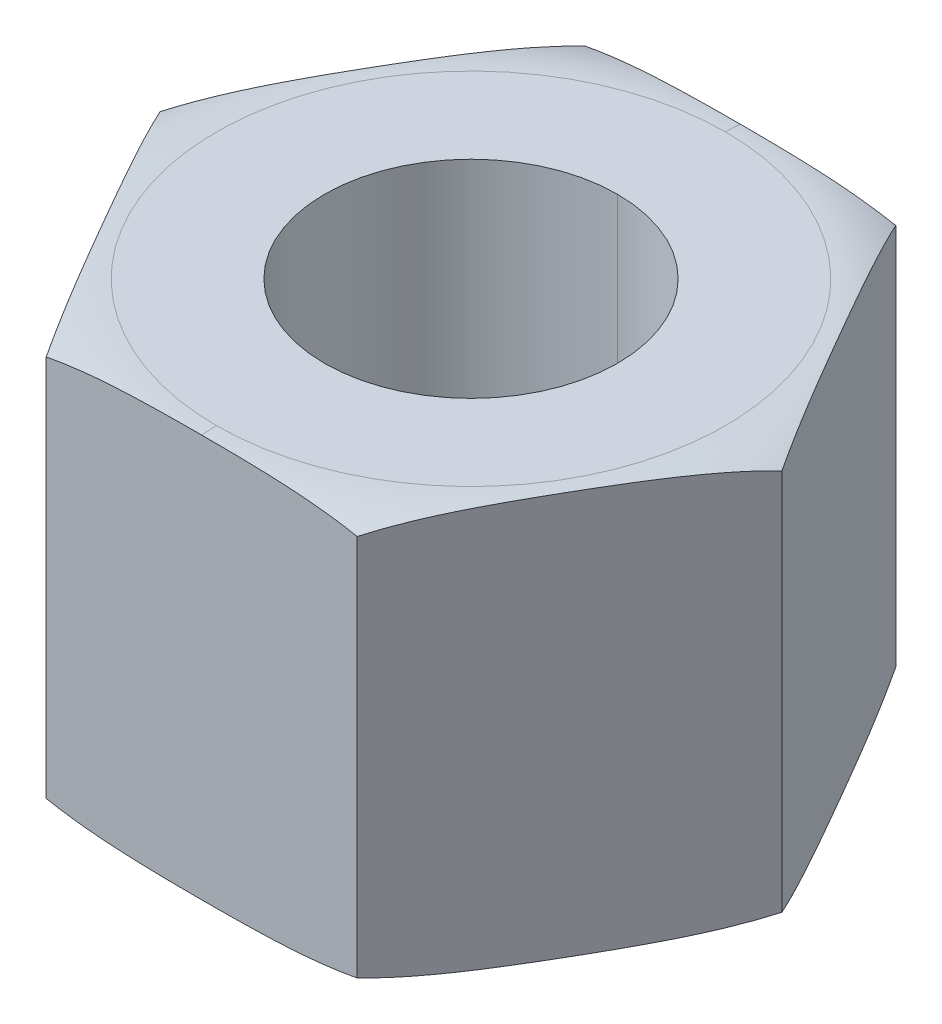
ISO-10303-21;
HEADER;
FILE_DESCRIPTION(('STEP AP214'),'2;1');
FILE_NAME('part.step','',(''),(''),'','','');
FILE_SCHEMA(('AUTOMOTIVE_DESIGN { 1 0 10303 214 1 1 1 1 }'));
ENDSEC;
DATA;
#1=APPLICATION_CONTEXT('core data for automotive mechanical design processes');
#2=APPLICATION_PROTOCOL_DEFINITION('international standard','automotive_design',2000,#1);
#3=PRODUCT_CONTEXT('',#1,'mechanical');
#4=PRODUCT('Part','Part','',(#3));
#5=PRODUCT_RELATED_PRODUCT_CATEGORY('part','',(#4));
#6=PRODUCT_DEFINITION_FORMATION('','',#4);
#7=PRODUCT_DEFINITION_CONTEXT('part definition',#1,'design');
#8=PRODUCT_DEFINITION('design','',#6,#7);
#9=PRODUCT_DEFINITION_SHAPE('','',#8);
#10=(LENGTH_UNIT() NAMED_UNIT(*) SI_UNIT(.MILLI.,.METRE.));
#11=(NAMED_UNIT(*) PLANE_ANGLE_UNIT() SI_UNIT($,.RADIAN.));
#12=(NAMED_UNIT(*) SI_UNIT($,.STERADIAN.) SOLID_ANGLE_UNIT());
#13=UNCERTAINTY_MEASURE_WITH_UNIT(LENGTH_MEASURE(1.E-05),#10,'distance_accuracy_value','');
#14=(GEOMETRIC_REPRESENTATION_CONTEXT(3) GLOBAL_UNCERTAINTY_ASSIGNED_CONTEXT((#13)) GLOBAL_UNIT_ASSIGNED_CONTEXT((#10,
#11,#12)) REPRESENTATION_CONTEXT('',''));
#15=CARTESIAN_POINT('',(0.,0.,0.));
#16=DIRECTION('',(0.,0.,1.));
#17=DIRECTION('',(1.,0.,0.));
#18=AXIS2_PLACEMENT_3D('',#15,#16,#17);
#19=CARTESIAN_POINT('',(0.,2.38125,0.));
#20=DIRECTION('',(0.,1.,0.));
#21=DIRECTION('',(0.,0.,1.));
#22=AXIS2_PLACEMENT_3D('',#19,#20,#21);
#23=CYLINDRICAL_SURFACE('',#22,1.7272);
#24=DIRECTION('',(0.,1.,0.));
#25=VECTOR('',#24,1.);
#26=CARTESIAN_POINT('',(0.,2.38125,-1.7272));
#27=LINE('',#26,#25);
#28=CARTESIAN_POINT('',(0.,-2.38125,-1.7272));
#29=VERTEX_POINT('',#28);
#30=CARTESIAN_POINT('',(0.,2.38125,-1.7272));
#31=VERTEX_POINT('',#30);
#32=EDGE_CURVE('E482',#29,#31,#27,.T.);
#33=ORIENTED_EDGE('',*,*,#32,.F.);
#34=CARTESIAN_POINT('',(0.,-2.38125,0.));
#35=DIRECTION('',(0.,1.,0.));
#36=DIRECTION('',(0.,0.,1.));
#37=AXIS2_PLACEMENT_3D('',#34,#35,#36);
#38=CIRCLE('',#37,1.7272);
#39=CARTESIAN_POINT('',(0.,-2.38125,1.7272));
#40=VERTEX_POINT('',#39);
#41=EDGE_CURVE('E10',#40,#29,#38,.T.);
#42=ORIENTED_EDGE('',*,*,#41,.F.);
#43=DIRECTION('',(0.,1.,0.));
#44=VECTOR('',#43,1.);
#45=CARTESIAN_POINT('',(0.,2.38125,1.7272));
#46=LINE('',#45,#44);
#47=CARTESIAN_POINT('',(0.,2.38125,1.7272));
#48=VERTEX_POINT('',#47);
#49=EDGE_CURVE('E465',#40,#48,#46,.T.);
#50=ORIENTED_EDGE('',*,*,#49,.T.);
#51=CARTESIAN_POINT('',(0.,2.38125,0.));
#52=DIRECTION('',(0.,1.,0.));
#53=DIRECTION('',(0.,0.,1.));
#54=AXIS2_PLACEMENT_3D('',#51,#52,#53);
#55=CIRCLE('',#54,1.7272);
#56=EDGE_CURVE('E475',#48,#31,#55,.T.);
#57=ORIENTED_EDGE('',*,*,#56,.T.);
#58=EDGE_LOOP('',(#33,#42,#50,#57));
#59=FACE_BOUND('',#58,.T.);
#60=ADVANCED_FACE('F16',(#59),#23,.F.);
#61=CARTESIAN_POINT('',(0.,-2.38125,0.));
#62=DIRECTION('',(0.,1.,0.));
#63=DIRECTION('',(1.,0.,0.));
#64=AXIS2_PLACEMENT_3D('',#61,#62,#63);
#65=PLANE('',#64);
#66=ORIENTED_EDGE('',*,*,#41,.T.);
#67=CARTESIAN_POINT('',(0.,-2.38125,0.));
#68=DIRECTION('',(0.,1.,0.));
#69=DIRECTION('',(0.,0.,1.));
#70=AXIS2_PLACEMENT_3D('',#67,#68,#69);
#71=CIRCLE('',#70,1.7272);
#72=EDGE_CURVE('E478',#29,#40,#71,.T.);
#73=ORIENTED_EDGE('',*,*,#72,.T.);
#74=EDGE_LOOP('',(#66,#73));
#75=FACE_BOUND('',#74,.T.);
#76=CARTESIAN_POINT('',(0.,-2.38125,0.));
#77=DIRECTION('',(0.,-1.,0.));
#78=DIRECTION('',(0.,0.,-1.));
#79=AXIS2_PLACEMENT_3D('',#76,#77,#78);
#80=CIRCLE('',#79,3.);
#81=CARTESIAN_POINT('',(0.,-2.38125,-3.));
#82=VERTEX_POINT('',#81);
#83=CARTESIAN_POINT('',(0.,-2.38125,3.));
#84=VERTEX_POINT('',#83);
#85=EDGE_CURVE('E29',#82,#84,#80,.T.);
#86=ORIENTED_EDGE('',*,*,#85,.T.);
#87=CARTESIAN_POINT('',(0.,-2.38125,0.));
#88=DIRECTION('',(0.,-1.,0.));
#89=DIRECTION('',(0.,0.,-1.));
#90=AXIS2_PLACEMENT_3D('',#87,#88,#89);
#91=CIRCLE('',#90,3.);
#92=EDGE_CURVE('E460',#84,#82,#91,.T.);
#93=ORIENTED_EDGE('',*,*,#92,.T.);
#94=EDGE_LOOP('',(#86,#93));
#95=FACE_BOUND('',#94,.T.);
#96=ADVANCED_FACE('F280',(#75,#95),#65,.F.);
#97=CARTESIAN_POINT('',(0.,-0.570552845635453,0.));
#98=DIRECTION('',(0.,1.,0.));
#99=DIRECTION('',(0.,0.,-1.));
#100=AXIS2_PLACEMENT_3D('',#97,#98,#99);
#101=TOROIDAL_SURFACE('',#100,3.,1.81069715436454);
#102=CARTESIAN_POINT('',(0.,-0.570552845635453,3.));
#103=DIRECTION('',(-1.,0.,0.));
#104=DIRECTION('',(0.,0.,1.));
#105=AXIS2_PLACEMENT_3D('',#102,#103,#104);
#106=CIRCLE('',#105,1.81069715436454);
#107=CARTESIAN_POINT('',(0.,-2.37277347164767,3.175));
#108=VERTEX_POINT('',#107);
#109=EDGE_CURVE('E269',#84,#108,#106,.T.);
#110=ORIENTED_EDGE('',*,*,#109,.F.);
#111=ORIENTED_EDGE('',*,*,#85,.F.);
#112=CARTESIAN_POINT('',(0.,-0.570552845635453,-3.));
#113=DIRECTION('',(1.,0.,0.));
#114=DIRECTION('',(0.,0.,-1.));
#115=AXIS2_PLACEMENT_3D('',#112,#113,#114);
#116=CIRCLE('',#115,1.81069715436454);
#117=CARTESIAN_POINT('',(0.,-2.37277347164767,-3.175));
#118=VERTEX_POINT('',#117);
#119=EDGE_CURVE('E353',#82,#118,#116,.T.);
#120=ORIENTED_EDGE('',*,*,#119,.T.);
#121=CARTESIAN_POINT('',(1.83308710467706,-2.25425,-3.175));
#122=CARTESIAN_POINT('',(1.45088136603896,-2.32986205561458,-3.175));
#123=CARTESIAN_POINT('',(0.921760532764785,-2.35518998730378,-3.175));
#124=CARTESIAN_POINT('',(0.554427423923844,-2.37277347164767,-3.175));
#125=CARTESIAN_POINT('',(0.,-2.37277347164767,-3.17499999999999));
#126=B_SPLINE_CURVE_WITH_KNOTS('',2,(#121,#122,#123,#124,#125),.UNSPECIFIED.,.F.,.F.,(3,2,3),
(0.,0.5,1.),.UNSPECIFIED.);
#127=CARTESIAN_POINT('',(1.83308710467706,-2.25425,-3.175));
#128=VERTEX_POINT('',#127);
#129=EDGE_CURVE('E537',#128,#118,#126,.T.);
#130=ORIENTED_EDGE('',*,*,#129,.F.);
#131=CARTESIAN_POINT('',(3.66617420935413,-2.25425,0.));
#132=CARTESIAN_POINT('',(3.4744423394548,-2.33011092695297,-0.33208934009582));
#133=CARTESIAN_POINT('',(3.20859300329362,-2.35537273657355,-0.792553897485451));
#134=CARTESIAN_POINT('',(3.02567349519758,-2.3727543025994,-1.10937977920329));
#135=CARTESIAN_POINT('',(2.75001639546939,-2.37277346254639,-1.5868318813996));
#136=CARTESIAN_POINT('',(2.47459812523946,-2.37279260589319,-2.06387031877057));
#137=CARTESIAN_POINT('',(2.29102642429865,-2.35540670895519,-2.38182583163189));
#138=CARTESIAN_POINT('',(2.02509653933133,-2.3302207486515,-2.84242990364623));
#139=CARTESIAN_POINT('',(1.83308710467706,-2.25425,-3.17500000000001));
#140=B_SPLINE_CURVE_WITH_KNOTS('',2,(#131,#132,#133,#134,#135,#136,#137,#138,#139),
.UNSPECIFIED.,.F.,.F.,(3,2,2,2,3),(0.,0.25,0.5,0.75,1.),.UNSPECIFIED.);
#141=CARTESIAN_POINT('',(3.66617420935413,-2.25425,0.));
#142=VERTEX_POINT('',#141);
#143=EDGE_CURVE('E308',#142,#128,#140,.T.);
#144=ORIENTED_EDGE('',*,*,#143,.F.);
#145=CARTESIAN_POINT('',(1.83308710467711,-2.25425000000003,3.175));
#146=CARTESIAN_POINT('',(2.02481897457498,-2.33011092695242,2.84291065990669));
#147=CARTESIAN_POINT('',(2.29066831073761,-2.35537273657358,2.38244610251456));
#148=CARTESIAN_POINT('',(2.47358781882122,-2.37275430259855,2.06562022081824));
#149=CARTESIAN_POINT('',(2.74924491856183,-2.37277346254642,1.58816811860041));
#150=CARTESIAN_POINT('',(3.0246631887793,-2.3727926058941,1.11112968125103));
#151=CARTESIAN_POINT('',(3.20823488973256,-2.35540670895522,0.793174168368133));
#152=CARTESIAN_POINT('',(3.47416477469843,-2.3302207486521,0.33257009635631));
#153=CARTESIAN_POINT('',(3.66617420935415,-2.25425000000003,0.));
#154=B_SPLINE_CURVE_WITH_KNOTS('',2,(#145,#146,#147,#148,#149,#150,#151,#152,#153),
.UNSPECIFIED.,.F.,.F.,(3,2,2,2,3),(0.,0.25,0.5,0.75,1.),.UNSPECIFIED.);
#155=CARTESIAN_POINT('',(1.83308710467711,-2.25425,3.175));
#156=VERTEX_POINT('',#155);
#157=EDGE_CURVE('E309',#156,#142,#154,.T.);
#158=ORIENTED_EDGE('',*,*,#157,.F.);
#159=CARTESIAN_POINT('',(0.,-2.37277347164767,3.17499999999998));
#160=CARTESIAN_POINT('',(0.552211008425735,-2.37277347164767,3.17499999999997));
#161=CARTESIAN_POINT('',(0.919657914692905,-2.35529032985451,3.17499999999997));
#162=CARTESIAN_POINT('',(1.44986548797196,-2.33006302755492,3.17499999999997));
#163=CARTESIAN_POINT('',(1.8330871046771,-2.25425,3.17499999999996));
#164=B_SPLINE_CURVE_WITH_KNOTS('',2,(#159,#160,#161,#162,#163),.UNSPECIFIED.,.F.,.F.,(3,2,3),
(0.,0.5,1.),.UNSPECIFIED.);
#165=EDGE_CURVE('E263',#108,#156,#164,.T.);
#166=ORIENTED_EDGE('',*,*,#165,.F.);
#167=EDGE_LOOP('',(#110,#111,#120,#130,#144,#158,#166));
#168=FACE_BOUND('',#167,.T.);
#169=ADVANCED_FACE('F271',(#168),#101,.T.);
#170=CARTESIAN_POINT('',(0.,2.38125,0.));
#171=DIRECTION('',(0.,1.,0.));
#172=DIRECTION('',(1.,0.,0.));
#173=AXIS2_PLACEMENT_3D('',#170,#171,#172);
#174=PLANE('',#173);
#175=ORIENTED_EDGE('',*,*,#56,.F.);
#176=CARTESIAN_POINT('',(0.,2.38125,0.));
#177=DIRECTION('',(0.,1.,0.));
#178=DIRECTION('',(0.,0.,1.));
#179=AXIS2_PLACEMENT_3D('',#176,#177,#178);
#180=CIRCLE('',#179,1.7272);
#181=EDGE_CURVE('E472',#31,#48,#180,.T.);
#182=ORIENTED_EDGE('',*,*,#181,.F.);
#183=EDGE_LOOP('',(#175,#182));
#184=FACE_BOUND('',#183,.T.);
#185=CARTESIAN_POINT('',(0.,2.38125,0.));
#186=DIRECTION('',(0.,-1.,0.));
#187=DIRECTION('',(0.,0.,-1.));
#188=AXIS2_PLACEMENT_3D('',#185,#186,#187);
#189=CIRCLE('',#188,3.);
#190=CARTESIAN_POINT('',(0.,2.38125,-3.));
#191=VERTEX_POINT('',#190);
#192=CARTESIAN_POINT('',(0.,2.38125,3.));
#193=VERTEX_POINT('',#192);
#194=EDGE_CURVE('E347',#191,#193,#189,.T.);
#195=ORIENTED_EDGE('',*,*,#194,.F.);
#196=CARTESIAN_POINT('',(0.,2.38125,0.));
#197=DIRECTION('',(0.,-1.,0.));
#198=DIRECTION('',(0.,0.,-1.));
#199=AXIS2_PLACEMENT_3D('',#196,#197,#198);
#200=CIRCLE('',#199,3.);
#201=EDGE_CURVE('E165',#193,#191,#200,.T.);
#202=ORIENTED_EDGE('',*,*,#201,.F.);
#203=EDGE_LOOP('',(#195,#202));
#204=FACE_BOUND('',#203,.T.);
#205=ADVANCED_FACE('F279',(#184,#204),#174,.T.);
#206=CARTESIAN_POINT('',(0.,0.570552845635453,0.));
#207=DIRECTION('',(0.,-1.,0.));
#208=DIRECTION('',(0.,0.,-1.));
#209=AXIS2_PLACEMENT_3D('',#206,#207,#208);
#210=TOROIDAL_SURFACE('',#209,3.,1.81069715436454);
#211=CARTESIAN_POINT('',(0.,0.570552845635453,3.));
#212=DIRECTION('',(1.,0.,0.));
#213=DIRECTION('',(0.,0.,-1.));
#214=AXIS2_PLACEMENT_3D('',#211,#212,#213);
#215=CIRCLE('',#214,1.81069715436454);
#216=CARTESIAN_POINT('',(0.,2.37277347164767,3.175));
#217=VERTEX_POINT('',#216);
#218=EDGE_CURVE('E340',#193,#217,#215,.T.);
#219=ORIENTED_EDGE('',*,*,#218,.F.);
#220=ORIENTED_EDGE('',*,*,#201,.T.);
#221=CARTESIAN_POINT('',(0.,0.570552845635453,-3.));
#222=DIRECTION('',(-1.,0.,0.));
#223=DIRECTION('',(0.,0.,1.));
#224=AXIS2_PLACEMENT_3D('',#221,#222,#223);
#225=CIRCLE('',#224,1.81069715436454);
#226=CARTESIAN_POINT('',(0.,2.37277347164767,-3.175));
#227=VERTEX_POINT('',#226);
#228=EDGE_CURVE('E162',#191,#227,#225,.T.);
#229=ORIENTED_EDGE('',*,*,#228,.T.);
#230=CARTESIAN_POINT('',(-1.83308710467708,2.25425,-3.17499999999999));
#231=CARTESIAN_POINT('',(-1.45088136604178,2.32986205561402,-3.17499999999999));
#232=CARTESIAN_POINT('',(-0.9217605327648,2.35518998730377,-3.17499999999999));
#233=CARTESIAN_POINT('',(-0.55442742393001,2.37277347164767,-3.17499999999999));
#234=CARTESIAN_POINT('',(0.,2.37277347164767,-3.17499999999999));
#235=B_SPLINE_CURVE_WITH_KNOTS('',2,(#230,#231,#232,#233,#234),.UNSPECIFIED.,.F.,.F.,(3,2,3),
(0.,0.5,1.),.UNSPECIFIED.);
#236=CARTESIAN_POINT('',(-1.83308710467708,2.25425,-3.175));
#237=VERTEX_POINT('',#236);
#238=EDGE_CURVE('E146',#237,#227,#235,.T.);
#239=ORIENTED_EDGE('',*,*,#238,.F.);
#240=CARTESIAN_POINT('',(-3.66617420935414,2.25425,0.));
#241=CARTESIAN_POINT('',(-3.4744423394562,2.33011092695242,-0.332089340093413));
#242=CARTESIAN_POINT('',(-3.20859300329363,2.35537273657355,-0.792553897485439));
#243=CARTESIAN_POINT('',(-3.02567349520988,2.37275430259851,-1.10937977918201));
#244=CARTESIAN_POINT('',(-2.7500163954694,2.37277346254639,-1.58683188139959));
#245=CARTESIAN_POINT('',(-2.4745981252505,2.37279260589407,-2.06387031875147));
#246=CARTESIAN_POINT('',(-2.29102642429867,2.35540670895519,-2.38182583163187));
#247=CARTESIAN_POINT('',(-2.02509653933215,2.33022074865181,-2.84242990364484));
#248=CARTESIAN_POINT('',(-1.83308710467708,2.25425,-3.175));
#249=B_SPLINE_CURVE_WITH_KNOTS('',2,(#240,#241,#242,#243,#244,#245,#246,#247,#248),
.UNSPECIFIED.,.F.,.F.,(3,2,2,2,3),(0.,0.25,0.5,0.75,1.),.UNSPECIFIED.);
#250=CARTESIAN_POINT('',(-3.66617420935412,2.25425,0.));
#251=VERTEX_POINT('',#250);
#252=EDGE_CURVE('E364',#251,#237,#249,.T.);
#253=ORIENTED_EDGE('',*,*,#252,.F.);
#254=CARTESIAN_POINT('',(-1.83308710467703,2.25425,3.175));
#255=CARTESIAN_POINT('',(-2.02481897457564,2.33011092695269,2.84291065990543));
#256=CARTESIAN_POINT('',(-2.29066831073755,2.35537273657355,2.38244610251456));
#257=CARTESIAN_POINT('',(-2.47358781882508,2.37275430259874,2.06562022081146));
#258=CARTESIAN_POINT('',(-2.74924491856178,2.37277346254639,1.58816811860041));
#259=CARTESIAN_POINT('',(-3.02466318879103,2.37279260589385,1.11112968123063));
#260=CARTESIAN_POINT('',(-3.20823488973252,2.35540670895519,0.79317416836813));
#261=CARTESIAN_POINT('',(-3.47416477470273,2.33022074865036,0.332570096348802));
#262=CARTESIAN_POINT('',(-3.66617420935412,2.25425,0.));
#263=B_SPLINE_CURVE_WITH_KNOTS('',2,(#254,#255,#256,#257,#258,#259,#260,#261,#262),
.UNSPECIFIED.,.F.,.F.,(3,2,2,2,3),(0.,0.25,0.5,0.75,1.),.UNSPECIFIED.);
#264=CARTESIAN_POINT('',(-1.83308710467703,2.25425,3.175));
#265=VERTEX_POINT('',#264);
#266=EDGE_CURVE('E363',#265,#251,#263,.T.);
#267=ORIENTED_EDGE('',*,*,#266,.F.);
#268=CARTESIAN_POINT('',(0.,2.37277347164767,3.17499999999998));
#269=CARTESIAN_POINT('',(-0.552211008422611,2.37277347164767,3.17499999999999));
#270=CARTESIAN_POINT('',(-0.919657914692842,2.3552903298545,3.17499999999999));
#271=CARTESIAN_POINT('',(-1.44986548797049,2.3300630275552,3.175));
#272=CARTESIAN_POINT('',(-1.83308710467703,2.25425,3.175));
#273=B_SPLINE_CURVE_WITH_KNOTS('',2,(#268,#269,#270,#271,#272),.UNSPECIFIED.,.F.,.F.,(3,2,3),
(0.,0.5,1.),.UNSPECIFIED.);
#274=EDGE_CURVE('E44',#217,#265,#273,.T.);
#275=ORIENTED_EDGE('',*,*,#274,.F.);
#276=EDGE_LOOP('',(#219,#220,#229,#239,#253,#267,#275));
#277=FACE_BOUND('',#276,.T.);
#278=ADVANCED_FACE('F164',(#277),#210,.T.);
#279=CARTESIAN_POINT('',(-1.83308710467703,2.38125,3.175));
#280=DIRECTION('',(0.,0.,-1.));
#281=DIRECTION('',(-1.,0.,0.));
#282=AXIS2_PLACEMENT_3D('',#279,#280,#281);
#283=PLANE('',#282);
#284=DIRECTION('',(0.,-1.,0.));
#285=VECTOR('',#284,1.);
#286=CARTESIAN_POINT('',(-1.83308710467703,2.38125,3.175));
#287=LINE('',#286,#285);
#288=CARTESIAN_POINT('',(-1.83308710467703,-2.25425,3.175));
#289=VERTEX_POINT('',#288);
#290=EDGE_CURVE('E361',#265,#289,#287,.T.);
#291=ORIENTED_EDGE('',*,*,#290,.T.);
#292=CARTESIAN_POINT('',(-1.83308710467704,-2.25425,3.175));
#293=CARTESIAN_POINT('',(-1.45088136603896,-2.32986205561458,3.175));
#294=CARTESIAN_POINT('',(-0.921760532764765,-2.35518998730378,3.17499999999999));
#295=CARTESIAN_POINT('',(-0.554427423923843,-2.37277347164767,3.17499999999999));
#296=CARTESIAN_POINT('',(0.,-2.37277347164767,3.17499999999998));
#297=B_SPLINE_CURVE_WITH_KNOTS('',2,(#292,#293,#294,#295,#296),.UNSPECIFIED.,.F.,.F.,(3,2,3),
(0.,0.5,1.),.UNSPECIFIED.);
#298=EDGE_CURVE('E447',#289,#108,#297,.T.);
#299=ORIENTED_EDGE('',*,*,#298,.T.);
#300=ORIENTED_EDGE('',*,*,#165,.T.);
#301=DIRECTION('',(0.,-1.,0.));
#302=VECTOR('',#301,1.);
#303=CARTESIAN_POINT('',(1.83308710467711,2.38125,3.175));
#304=LINE('',#303,#302);
#305=CARTESIAN_POINT('',(1.8330871046771,2.25425,3.175));
#306=VERTEX_POINT('',#305);
#307=EDGE_CURVE('E170',#306,#156,#304,.T.);
#308=ORIENTED_EDGE('',*,*,#307,.F.);
#309=CARTESIAN_POINT('',(1.8330871046771,2.25425,3.17499999999996));
#310=CARTESIAN_POINT('',(1.45088136603898,2.32986205561459,3.17499999999997));
#311=CARTESIAN_POINT('',(0.921760532764825,2.35518998730378,3.17499999999997));
#312=CARTESIAN_POINT('',(0.55442742392383,2.37277347164767,3.17499999999997));
#313=CARTESIAN_POINT('',(0.,2.37277347164767,3.17499999999998));
#314=B_SPLINE_CURVE_WITH_KNOTS('',2,(#309,#310,#311,#312,#313),.UNSPECIFIED.,.F.,.F.,(3,2,3),
(0.,0.5,1.),.UNSPECIFIED.);
#315=EDGE_CURVE('E223',#306,#217,#314,.T.);
#316=ORIENTED_EDGE('',*,*,#315,.T.);
#317=ORIENTED_EDGE('',*,*,#274,.T.);
#318=EDGE_LOOP('',(#291,#299,#300,#308,#316,#317));
#319=FACE_BOUND('',#318,.T.);
#320=ADVANCED_FACE('F228',(#319),#283,.F.);
#321=CARTESIAN_POINT('',(-3.66617420935412,2.38125,0.));
#322=DIRECTION('',(0.866025403784435,0.,-0.500000000000007));
#323=DIRECTION('',(0.,-1.,0.));
#324=AXIS2_PLACEMENT_3D('',#321,#322,#323);
#325=PLANE('',#324);
#326=DIRECTION('',(0.,-1.,0.));
#327=VECTOR('',#326,1.);
#328=CARTESIAN_POINT('',(-3.66617420935412,2.38125,0.));
#329=LINE('',#328,#327);
#330=CARTESIAN_POINT('',(-3.66617420935412,-2.25425,0.));
#331=VERTEX_POINT('',#330);
#332=EDGE_CURVE('E110',#251,#331,#329,.T.);
#333=ORIENTED_EDGE('',*,*,#332,.T.);
#334=CARTESIAN_POINT('',(-3.66617420935412,-2.25425,0.));
#335=CARTESIAN_POINT('',(-3.47444233945623,-2.3301109269524,0.33208934009334));
#336=CARTESIAN_POINT('',(-3.20859300329361,-2.35537273657355,0.792553897485447));
#337=CARTESIAN_POINT('',(-3.0256734952146,-2.37275430259808,1.1093797791738));
#338=CARTESIAN_POINT('',(-2.75001639546938,-2.37277346254639,1.58683188139959));
#339=CARTESIAN_POINT('',(-2.47459812524713,-2.37279260589452,2.06387031875725));
#340=CARTESIAN_POINT('',(-2.29102642429864,-2.35540670895519,2.38182583163188));
#341=CARTESIAN_POINT('',(-2.02509653932843,-2.33022074865037,2.84242990365121));
#342=CARTESIAN_POINT('',(-1.83308710467703,-2.25425,3.175));
#343=B_SPLINE_CURVE_WITH_KNOTS('',2,(#334,#335,#336,#337,#338,#339,#340,#341,#342),
.UNSPECIFIED.,.F.,.F.,(3,2,2,2,3),(0.,0.25,0.5,0.75,1.),.UNSPECIFIED.);
#344=EDGE_CURVE('E428',#331,#289,#343,.T.);
#345=ORIENTED_EDGE('',*,*,#344,.T.);
#346=ORIENTED_EDGE('',*,*,#290,.F.);
#347=ORIENTED_EDGE('',*,*,#266,.T.);
#348=EDGE_LOOP('',(#333,#345,#346,#347));
#349=FACE_BOUND('',#348,.T.);
#350=ADVANCED_FACE('F237',(#349),#325,.F.);
#351=CARTESIAN_POINT('',(-1.83308710467708,2.38125,-3.175));
#352=DIRECTION('',(0.866025403784441,0.,0.5));
#353=DIRECTION('',(0.,-1.,0.));
#354=AXIS2_PLACEMENT_3D('',#351,#352,#353);
#355=PLANE('',#354);
#356=DIRECTION('',(0.,-1.,0.));
#357=VECTOR('',#356,1.);
#358=CARTESIAN_POINT('',(-1.83308710467708,2.38125,-3.175));
#359=LINE('',#358,#357);
#360=CARTESIAN_POINT('',(-1.83308710467708,-2.25425,-3.175));
#361=VERTEX_POINT('',#360);
#362=EDGE_CURVE('E97',#237,#361,#359,.T.);
#363=ORIENTED_EDGE('',*,*,#362,.T.);
#364=CARTESIAN_POINT('',(-1.83308710467708,-2.25425,-3.175));
#365=CARTESIAN_POINT('',(-2.02481897457497,-2.3301109269524,-2.84291065990667));
#366=CARTESIAN_POINT('',(-2.29066831073759,-2.35537273657355,-2.38244610251455));
#367=CARTESIAN_POINT('',(-2.47358781881654,-2.37275430259808,-2.0656202208263));
#368=CARTESIAN_POINT('',(-2.74924491856181,-2.37277346254639,-1.5881681186004));
#369=CARTESIAN_POINT('',(-3.02466318878413,-2.37279260589451,-1.11112968124261));
#370=CARTESIAN_POINT('',(-3.20823488973255,-2.35540670895519,-0.793174168368118));
#371=CARTESIAN_POINT('',(-3.47416477470276,-2.33022074865035,-0.332570096348757));
#372=CARTESIAN_POINT('',(-3.66617420935414,-2.25425,0.));
#373=B_SPLINE_CURVE_WITH_KNOTS('',2,(#364,#365,#366,#367,#368,#369,#370,#371,#372),
.UNSPECIFIED.,.F.,.F.,(3,2,2,2,3),(0.,0.25,0.5,0.75,1.),.UNSPECIFIED.);
#374=EDGE_CURVE('E418',#361,#331,#373,.T.);
#375=ORIENTED_EDGE('',*,*,#374,.T.);
#376=ORIENTED_EDGE('',*,*,#332,.F.);
#377=ORIENTED_EDGE('',*,*,#252,.T.);
#378=EDGE_LOOP('',(#363,#375,#376,#377));
#379=FACE_BOUND('',#378,.T.);
#380=ADVANCED_FACE('F392',(#379),#355,.F.);
#381=CARTESIAN_POINT('',(1.83308710467706,2.38125,-3.175));
#382=DIRECTION('',(0.,0.,1.));
#383=DIRECTION('',(1.,0.,0.));
#384=AXIS2_PLACEMENT_3D('',#381,#382,#383);
#385=PLANE('',#384);
#386=DIRECTION('',(0.,-1.,0.));
#387=VECTOR('',#386,1.);
#388=CARTESIAN_POINT('',(1.83308710467706,2.38125,-3.175));
#389=LINE('',#388,#387);
#390=CARTESIAN_POINT('',(1.83308710467706,2.25425,-3.175));
#391=VERTEX_POINT('',#390);
#392=EDGE_CURVE('E531',#391,#128,#389,.T.);
#393=ORIENTED_EDGE('',*,*,#392,.T.);
#394=ORIENTED_EDGE('',*,*,#129,.T.);
#395=CARTESIAN_POINT('',(0.,-2.37277347164767,-3.17499999999999));
#396=CARTESIAN_POINT('',(-0.552211008419525,-2.37277347164767,-3.17499999999999));
#397=CARTESIAN_POINT('',(-0.919657914692875,-2.3552903298545,-3.17499999999999));
#398=CARTESIAN_POINT('',(-1.44986548796911,-2.33006302755548,-3.17499999999999));
#399=CARTESIAN_POINT('',(-1.83308710467708,-2.25425,-3.17499999999999));
#400=B_SPLINE_CURVE_WITH_KNOTS('',2,(#395,#396,#397,#398,#399),.UNSPECIFIED.,.F.,.F.,(3,2,3),
(0.,0.5,1.),.UNSPECIFIED.);
#401=EDGE_CURVE('E509',#118,#361,#400,.T.);
#402=ORIENTED_EDGE('',*,*,#401,.T.);
#403=ORIENTED_EDGE('',*,*,#362,.F.);
#404=ORIENTED_EDGE('',*,*,#238,.T.);
#405=CARTESIAN_POINT('',(0.,2.37277347164767,-3.17499999999999));
#406=CARTESIAN_POINT('',(0.552211008422594,2.37277347164767,-3.175));
#407=CARTESIAN_POINT('',(0.919657914692854,2.3552903298545,-3.175));
#408=CARTESIAN_POINT('',(1.44986548797048,2.3300630275552,-3.175));
#409=CARTESIAN_POINT('',(1.83308710467706,2.25425,-3.175));
#410=B_SPLINE_CURVE_WITH_KNOTS('',2,(#405,#406,#407,#408,#409),.UNSPECIFIED.,.F.,.F.,(3,2,3),
(0.,0.5,1.),.UNSPECIFIED.);
#411=EDGE_CURVE('E152',#227,#391,#410,.T.);
#412=ORIENTED_EDGE('',*,*,#411,.T.);
#413=EDGE_LOOP('',(#393,#394,#402,#403,#404,#412));
#414=FACE_BOUND('',#413,.T.);
#415=ADVANCED_FACE('F150',(#414),#385,.F.);
#416=CARTESIAN_POINT('',(3.66617420935413,2.38125,0.));
#417=DIRECTION('',(-0.866025403784438,0.,0.5));
#418=DIRECTION('',(0.,1.,0.));
#419=AXIS2_PLACEMENT_3D('',#416,#417,#418);
#420=PLANE('',#419);
#421=DIRECTION('',(0.,-1.,0.));
#422=VECTOR('',#421,1.);
#423=CARTESIAN_POINT('',(3.66617420935413,2.38125,0.));
#424=LINE('',#423,#422);
#425=CARTESIAN_POINT('',(3.66617420935413,2.25425,0.));
#426=VERTEX_POINT('',#425);
#427=EDGE_CURVE('E299',#426,#142,#424,.T.);
#428=ORIENTED_EDGE('',*,*,#427,.T.);
#429=ORIENTED_EDGE('',*,*,#143,.T.);
#430=ORIENTED_EDGE('',*,*,#392,.F.);
#431=CARTESIAN_POINT('',(1.83308710467706,2.25425,-3.17500000000001));
#432=CARTESIAN_POINT('',(2.0248189745764,2.33011092695297,-2.84291065990417));
#433=CARTESIAN_POINT('',(2.29066831073757,2.35537273657355,-2.38244610251457));
#434=CARTESIAN_POINT('',(2.47358781882435,2.37275430259851,-2.06562022081276));
#435=CARTESIAN_POINT('',(2.7492449185618,2.37277346254639,-1.58816811860042));
#436=CARTESIAN_POINT('',(3.02466318878876,2.37279260589407,-1.11112968123457));
#437=CARTESIAN_POINT('',(3.20823488973253,2.35540670895519,-0.793174168368132));
#438=CARTESIAN_POINT('',(3.47416477470275,2.33022074865035,-0.332570096348766));
#439=CARTESIAN_POINT('',(3.66617420935413,2.25425,0.));
#440=B_SPLINE_CURVE_WITH_KNOTS('',2,(#431,#432,#433,#434,#435,#436,#437,#438,#439),
.UNSPECIFIED.,.F.,.F.,(3,2,2,2,3),(0.,0.25,0.5,0.75,1.),.UNSPECIFIED.);
#441=EDGE_CURVE('E176',#391,#426,#440,.T.);
#442=ORIENTED_EDGE('',*,*,#441,.T.);
#443=EDGE_LOOP('',(#428,#429,#430,#442));
#444=FACE_BOUND('',#443,.T.);
#445=ADVANCED_FACE('F200',(#444),#420,.F.);
#446=CARTESIAN_POINT('',(1.83308710467711,2.38125,3.175));
#447=DIRECTION('',(-0.866025403784442,0.,-0.5));
#448=DIRECTION('',(-0.5,0.,0.866025403784442));
#449=AXIS2_PLACEMENT_3D('',#446,#447,#448);
#450=PLANE('',#449);
#451=ORIENTED_EDGE('',*,*,#307,.T.);
#452=ORIENTED_EDGE('',*,*,#157,.T.);
#453=ORIENTED_EDGE('',*,*,#427,.F.);
#454=CARTESIAN_POINT('',(3.66617420935415,2.25425,0.));
#455=CARTESIAN_POINT('',(3.47444233945482,2.33011092695297,0.332089340095848));
#456=CARTESIAN_POINT('',(3.20859300329365,2.35537273657355,0.792553897485454));
#457=CARTESIAN_POINT('',(3.02567349520455,2.37275430259873,1.10937977919127));
#458=CARTESIAN_POINT('',(2.75001639546943,2.37277346254639,1.5868318813996));
#459=CARTESIAN_POINT('',(2.47459812524649,2.37279260589385,2.06387031875845));
#460=CARTESIAN_POINT('',(2.2910264242987,2.35540670895519,2.38182583163188));
#461=CARTESIAN_POINT('',(2.02509653933138,2.3302207486515,2.84242990364622));
#462=CARTESIAN_POINT('',(1.8330871046771,2.25425,3.175));
#463=B_SPLINE_CURVE_WITH_KNOTS('',2,(#454,#455,#456,#457,#458,#459,#460,#461,#462),
.UNSPECIFIED.,.F.,.F.,(3,2,2,2,3),(0.,0.25,0.5,0.75,1.),.UNSPECIFIED.);
#464=EDGE_CURVE('E338',#426,#306,#463,.T.);
#465=ORIENTED_EDGE('',*,*,#464,.T.);
#466=EDGE_LOOP('',(#451,#452,#453,#465));
#467=FACE_BOUND('',#466,.T.);
#468=ADVANCED_FACE('F198',(#467),#450,.F.);
#469=CARTESIAN_POINT('',(0.,0.570552845635453,0.));
#470=DIRECTION('',(0.,-1.,0.));
#471=DIRECTION('',(0.,0.,-1.));
#472=AXIS2_PLACEMENT_3D('',#469,#470,#471);
#473=TOROIDAL_SURFACE('',#472,3.,1.81069715436454);
#474=ORIENTED_EDGE('',*,*,#194,.T.);
#475=ORIENTED_EDGE('',*,*,#218,.T.);
#476=ORIENTED_EDGE('',*,*,#315,.F.);
#477=ORIENTED_EDGE('',*,*,#464,.F.);
#478=ORIENTED_EDGE('',*,*,#441,.F.);
#479=ORIENTED_EDGE('',*,*,#411,.F.);
#480=ORIENTED_EDGE('',*,*,#228,.F.);
#481=EDGE_LOOP('',(#474,#475,#476,#477,#478,#479,#480));
#482=FACE_BOUND('',#481,.T.);
#483=ADVANCED_FACE('F173',(#482),#473,.T.);
#484=CARTESIAN_POINT('',(0.,-0.570552845635453,0.));
#485=DIRECTION('',(0.,1.,0.));
#486=DIRECTION('',(0.,0.,-1.));
#487=AXIS2_PLACEMENT_3D('',#484,#485,#486);
#488=TOROIDAL_SURFACE('',#487,3.,1.81069715436454);
#489=ORIENTED_EDGE('',*,*,#92,.F.);
#490=ORIENTED_EDGE('',*,*,#109,.T.);
#491=ORIENTED_EDGE('',*,*,#298,.F.);
#492=ORIENTED_EDGE('',*,*,#344,.F.);
#493=ORIENTED_EDGE('',*,*,#374,.F.);
#494=ORIENTED_EDGE('',*,*,#401,.F.);
#495=ORIENTED_EDGE('',*,*,#119,.F.);
#496=EDGE_LOOP('',(#489,#490,#491,#492,#493,#494,#495));
#497=FACE_BOUND('',#496,.T.);
#498=ADVANCED_FACE('F197',(#497),#488,.T.);
#499=CARTESIAN_POINT('',(0.,2.38125,0.));
#500=DIRECTION('',(0.,1.,0.));
#501=DIRECTION('',(0.,0.,1.));
#502=AXIS2_PLACEMENT_3D('',#499,#500,#501);
#503=CYLINDRICAL_SURFACE('',#502,1.7272);
#504=ORIENTED_EDGE('',*,*,#72,.F.);
#505=ORIENTED_EDGE('',*,*,#32,.T.);
#506=ORIENTED_EDGE('',*,*,#181,.T.);
#507=ORIENTED_EDGE('',*,*,#49,.F.);
#508=EDGE_LOOP('',(#504,#505,#506,#507));
#509=FACE_BOUND('',#508,.T.);
#510=ADVANCED_FACE('F18',(#509),#503,.F.);
#511=CLOSED_SHELL('',(#60,#96,#169,#205,#278,#320,#350,#380,#415,#445,#468,#483,#498,#510));
#512=MANIFOLD_SOLID_BREP('B1',#511);
#513=ADVANCED_BREP_SHAPE_REPRESENTATION('',(#18,#512),#14);
#514=SHAPE_DEFINITION_REPRESENTATION(#9,#513);
ENDSEC;
END-ISO-10303-21;
